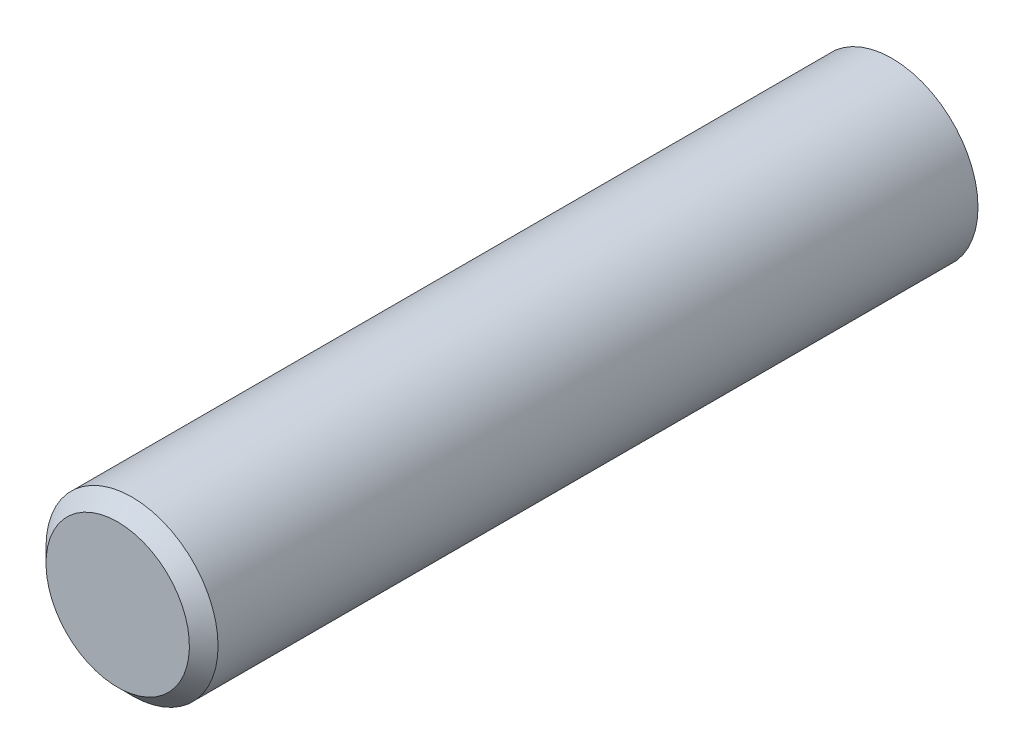
ISO-10303-21;
HEADER;
FILE_DESCRIPTION(('STEP AP214'),'2;1');
FILE_NAME('part.step','',(''),(''),'','','');
FILE_SCHEMA(('AUTOMOTIVE_DESIGN { 1 0 10303 214 1 1 1 1 }'));
ENDSEC;
DATA;
#1=APPLICATION_CONTEXT('core data for automotive mechanical design processes');
#2=APPLICATION_PROTOCOL_DEFINITION('international standard','automotive_design',2000,#1);
#3=PRODUCT_CONTEXT('',#1,'mechanical');
#4=PRODUCT('Part','Part','',(#3));
#5=PRODUCT_RELATED_PRODUCT_CATEGORY('part','',(#4));
#6=PRODUCT_DEFINITION_FORMATION('','',#4);
#7=PRODUCT_DEFINITION_CONTEXT('part definition',#1,'design');
#8=PRODUCT_DEFINITION('design','',#6,#7);
#9=PRODUCT_DEFINITION_SHAPE('','',#8);
#10=(LENGTH_UNIT() NAMED_UNIT(*) SI_UNIT(.MILLI.,.METRE.));
#11=(NAMED_UNIT(*) PLANE_ANGLE_UNIT() SI_UNIT($,.RADIAN.));
#12=(NAMED_UNIT(*) SI_UNIT($,.STERADIAN.) SOLID_ANGLE_UNIT());
#13=UNCERTAINTY_MEASURE_WITH_UNIT(LENGTH_MEASURE(1.E-05),#10,'distance_accuracy_value','');
#14=(GEOMETRIC_REPRESENTATION_CONTEXT(3) GLOBAL_UNCERTAINTY_ASSIGNED_CONTEXT((#13)) GLOBAL_UNIT_ASSIGNED_CONTEXT((#10,
#11,#12)) REPRESENTATION_CONTEXT('',''));
#15=CARTESIAN_POINT('',(0.,0.,0.));
#16=DIRECTION('',(0.,0.,1.));
#17=DIRECTION('',(1.,0.,0.));
#18=AXIS2_PLACEMENT_3D('',#15,#16,#17);
#19=CARTESIAN_POINT('',(78.75,3.,29.));
#20=DIRECTION('',(0.,0.,-1.));
#21=DIRECTION('',(0.,1.,0.));
#22=AXIS2_PLACEMENT_3D('',#19,#20,#21);
#23=PLANE('',#22);
#24=CARTESIAN_POINT('',(78.75,0.,29.));
#25=DIRECTION('',(0.,0.,-1.));
#26=DIRECTION('',(0.,1.,0.));
#27=AXIS2_PLACEMENT_3D('',#24,#25,#26);
#28=CIRCLE('',#27,2.49999999999999);
#29=CARTESIAN_POINT('',(78.75,2.49999999999999,29.));
#30=VERTEX_POINT('',#29);
#31=EDGE_CURVE('E56',#30,#30,#28,.F.);
#32=ORIENTED_EDGE('',*,*,#31,.T.);
#33=EDGE_LOOP('',(#32));
#34=FACE_BOUND('',#33,.T.);
#35=ADVANCED_FACE('F47',(#34),#23,.F.);
#36=CARTESIAN_POINT('',(78.75,3.,2.));
#37=DIRECTION('',(0.,0.,1.));
#38=DIRECTION('',(0.,-1.,0.));
#39=AXIS2_PLACEMENT_3D('',#36,#37,#38);
#40=PLANE('',#39);
#41=CARTESIAN_POINT('',(78.75,0.,2.));
#42=DIRECTION('',(0.,0.,-1.));
#43=DIRECTION('',(0.,1.,0.));
#44=AXIS2_PLACEMENT_3D('',#41,#42,#43);
#45=CIRCLE('',#44,1.58750000000001);
#46=CARTESIAN_POINT('',(78.75,1.58750000000001,2.));
#47=VERTEX_POINT('',#46);
#48=EDGE_CURVE('E72',#47,#47,#45,.T.);
#49=ORIENTED_EDGE('',*,*,#48,.F.);
#50=EDGE_LOOP('',(#49));
#51=FACE_BOUND('',#50,.T.);
#52=CARTESIAN_POINT('',(78.75,0.,2.));
#53=DIRECTION('',(0.,0.,1.));
#54=DIRECTION('',(0.,-1.,0.));
#55=AXIS2_PLACEMENT_3D('',#52,#53,#54);
#56=CIRCLE('',#55,3.);
#57=CARTESIAN_POINT('',(78.75,-3.,2.));
#58=VERTEX_POINT('',#57);
#59=EDGE_CURVE('E71',#58,#58,#56,.T.);
#60=ORIENTED_EDGE('',*,*,#59,.F.);
#61=EDGE_LOOP('',(#60));
#62=FACE_BOUND('',#61,.T.);
#63=ADVANCED_FACE('F92',(#51,#62),#40,.F.);
#64=CARTESIAN_POINT('',(78.75,0.,22.));
#65=DIRECTION('',(0.,0.,1.));
#66=DIRECTION('',(0.,-1.,0.));
#67=AXIS2_PLACEMENT_3D('',#64,#65,#66);
#68=CYLINDRICAL_SURFACE('',#67,3.);
#69=CARTESIAN_POINT('',(78.75,0.,28.5));
#70=DIRECTION('',(0.,0.,-1.));
#71=DIRECTION('',(0.,1.,0.));
#72=AXIS2_PLACEMENT_3D('',#69,#70,#71);
#73=CIRCLE('',#72,3.);
#74=CARTESIAN_POINT('',(78.75,3.,28.5));
#75=VERTEX_POINT('',#74);
#76=EDGE_CURVE('E11',#75,#75,#73,.T.);
#77=ORIENTED_EDGE('',*,*,#76,.T.);
#78=EDGE_LOOP('',(#77));
#79=FACE_BOUND('',#78,.T.);
#80=ORIENTED_EDGE('',*,*,#59,.T.);
#81=EDGE_LOOP('',(#80));
#82=FACE_BOUND('',#81,.T.);
#83=ADVANCED_FACE('F64',(#79,#82),#68,.T.);
#84=CARTESIAN_POINT('',(78.75,0.,12.));
#85=DIRECTION('',(0.,0.,-1.));
#86=DIRECTION('',(0.,1.,0.));
#87=AXIS2_PLACEMENT_3D('',#84,#85,#86);
#88=CONICAL_SURFACE('',#87,1.58749999999999,1.02974425867665);
#89=CARTESIAN_POINT('',(78.75,0.,12.9538662327063));
#90=VERTEX_POINT('',#89);
#91=VERTEX_LOOP('',#90);
#92=FACE_BOUND('',#91,.T.);
#93=CARTESIAN_POINT('',(78.75,0.,12.));
#94=DIRECTION('',(0.,0.,-1.));
#95=DIRECTION('',(0.,1.,0.));
#96=AXIS2_PLACEMENT_3D('',#93,#94,#95);
#97=CIRCLE('',#96,1.58749999999999);
#98=CARTESIAN_POINT('',(78.75,1.58749999999999,12.));
#99=VERTEX_POINT('',#98);
#100=EDGE_CURVE('E68',#99,#99,#97,.T.);
#101=ORIENTED_EDGE('',*,*,#100,.T.);
#102=EDGE_LOOP('',(#101));
#103=FACE_BOUND('',#102,.T.);
#104=ADVANCED_FACE('F60',(#92,#103),#88,.F.);
#105=CARTESIAN_POINT('',(78.75,0.,2.));
#106=DIRECTION('',(0.,0.,-1.));
#107=DIRECTION('',(0.,1.,0.));
#108=AXIS2_PLACEMENT_3D('',#105,#106,#107);
#109=CYLINDRICAL_SURFACE('',#108,1.5875);
#110=ORIENTED_EDGE('',*,*,#100,.F.);
#111=EDGE_LOOP('',(#110));
#112=FACE_BOUND('',#111,.T.);
#113=ORIENTED_EDGE('',*,*,#48,.T.);
#114=EDGE_LOOP('',(#113));
#115=FACE_BOUND('',#114,.T.);
#116=ADVANCED_FACE('F63',(#112,#115),#109,.F.);
#117=CARTESIAN_POINT('',(78.75,0.,29.));
#118=DIRECTION('',(0.,0.,-1.));
#119=DIRECTION('',(0.,1.,0.));
#120=AXIS2_PLACEMENT_3D('',#117,#118,#119);
#121=CONICAL_SURFACE('',#120,2.49999999999999,0.785398163397447);
#122=ORIENTED_EDGE('',*,*,#76,.F.);
#123=EDGE_LOOP('',(#122));
#124=FACE_BOUND('',#123,.T.);
#125=ORIENTED_EDGE('',*,*,#31,.F.);
#126=EDGE_LOOP('',(#125));
#127=FACE_BOUND('',#126,.T.);
#128=ADVANCED_FACE('F50',(#124,#127),#121,.T.);
#129=CLOSED_SHELL('',(#35,#63,#83,#104,#116,#128));
#130=MANIFOLD_SOLID_BREP('B2',#129);
#131=ADVANCED_BREP_SHAPE_REPRESENTATION('',(#18,#130),#14);
#132=SHAPE_DEFINITION_REPRESENTATION(#9,#131);
ENDSEC;
END-ISO-10303-21;
